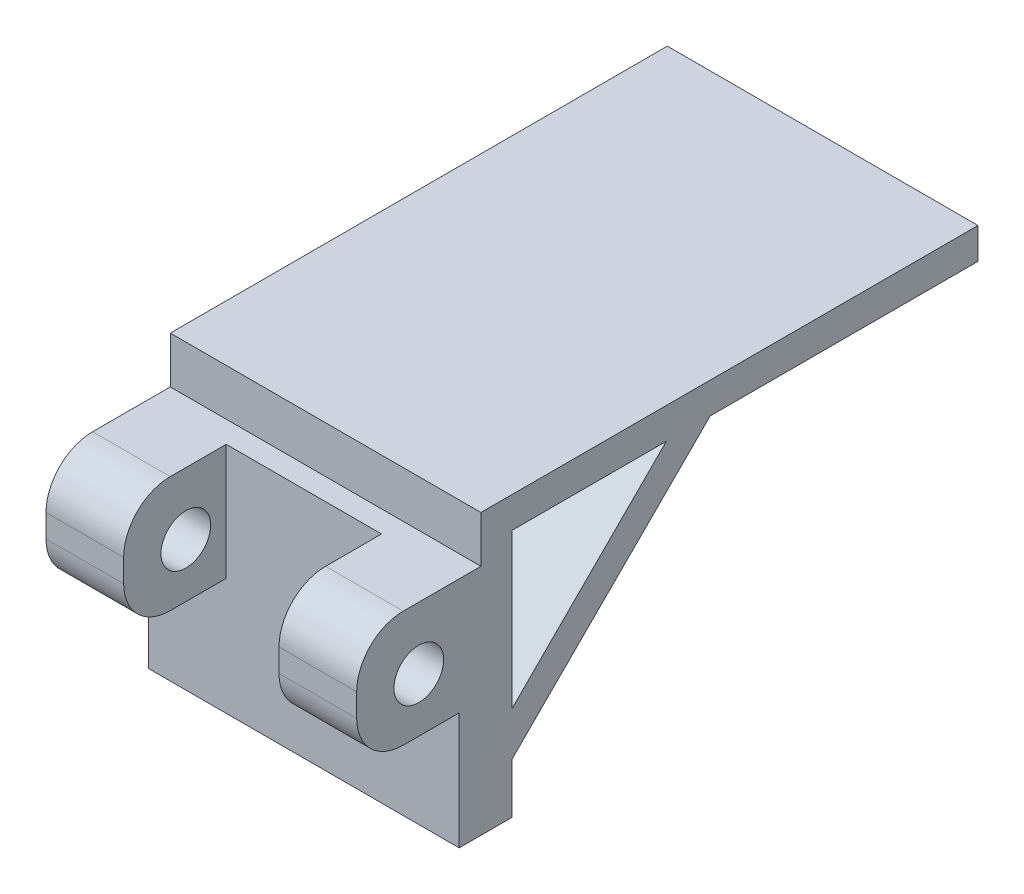
ISO-10303-21;
HEADER;
FILE_DESCRIPTION(('STEP AP214'),'2;1');
FILE_NAME('part.step','',(''),(''),'','','');
FILE_SCHEMA(('AUTOMOTIVE_DESIGN { 1 0 10303 214 1 1 1 1 }'));
ENDSEC;
DATA;
#1=APPLICATION_CONTEXT('core data for automotive mechanical design processes');
#2=APPLICATION_PROTOCOL_DEFINITION('international standard','automotive_design',2000,#1);
#3=PRODUCT_CONTEXT('',#1,'mechanical');
#4=PRODUCT('Part','Part','',(#3));
#5=PRODUCT_RELATED_PRODUCT_CATEGORY('part','',(#4));
#6=PRODUCT_DEFINITION_FORMATION('','',#4);
#7=PRODUCT_DEFINITION_CONTEXT('part definition',#1,'design');
#8=PRODUCT_DEFINITION('design','',#6,#7);
#9=PRODUCT_DEFINITION_SHAPE('','',#8);
#10=(LENGTH_UNIT() NAMED_UNIT(*) SI_UNIT(.MILLI.,.METRE.));
#11=(NAMED_UNIT(*) PLANE_ANGLE_UNIT() SI_UNIT($,.RADIAN.));
#12=(NAMED_UNIT(*) SI_UNIT($,.STERADIAN.) SOLID_ANGLE_UNIT());
#13=UNCERTAINTY_MEASURE_WITH_UNIT(LENGTH_MEASURE(1.E-05),#10,'distance_accuracy_value','');
#14=(GEOMETRIC_REPRESENTATION_CONTEXT(3) GLOBAL_UNCERTAINTY_ASSIGNED_CONTEXT((#13)) GLOBAL_UNIT_ASSIGNED_CONTEXT((#10,
#11,#12)) REPRESENTATION_CONTEXT('',''));
#15=CARTESIAN_POINT('',(0.,0.,0.));
#16=DIRECTION('',(0.,0.,1.));
#17=DIRECTION('',(1.,0.,0.));
#18=AXIS2_PLACEMENT_3D('',#15,#16,#17);
#19=CARTESIAN_POINT('',(5.,0.,8.));
#20=DIRECTION('',(1.,0.,0.));
#21=DIRECTION('',(0.,0.,-1.));
#22=AXIS2_PLACEMENT_3D('',#19,#20,#21);
#23=PLANE('',#22);
#24=CARTESIAN_POINT('',(5.,3.5,4.));
#25=DIRECTION('',(1.,0.,0.));
#26=DIRECTION('',(0.,0.,-1.));
#27=AXIS2_PLACEMENT_3D('',#24,#25,#26);
#28=CIRCLE('',#27,1.6);
#29=CARTESIAN_POINT('',(5.,3.5,2.4));
#30=VERTEX_POINT('',#29);
#31=EDGE_CURVE('E288',#30,#30,#28,.T.);
#32=ORIENTED_EDGE('',*,*,#31,.T.);
#33=EDGE_LOOP('',(#32));
#34=FACE_BOUND('',#33,.T.);
#35=DIRECTION('',(0.,1.,0.));
#36=VECTOR('',#35,1.);
#37=CARTESIAN_POINT('',(5.,0.0262521424332228,1.4));
#38=LINE('',#37,#36);
#39=CARTESIAN_POINT('',(5.,0.0262521424332228,1.4));
#40=VERTEX_POINT('',#39);
#41=CARTESIAN_POINT('',(5.,7.5,1.4));
#42=VERTEX_POINT('',#41);
#43=EDGE_CURVE('E195',#40,#42,#38,.T.);
#44=ORIENTED_EDGE('',*,*,#43,.F.);
#45=DIRECTION('',(0.,0.,1.));
#46=VECTOR('',#45,1.);
#47=CARTESIAN_POINT('',(5.,0.0262521424332228,-21.3692412432328));
#48=LINE('',#47,#46);
#49=CARTESIAN_POINT('',(5.,0.0262521424332228,4.99999999999999));
#50=VERTEX_POINT('',#49);
#51=EDGE_CURVE('E185',#40,#50,#48,.T.);
#52=ORIENTED_EDGE('',*,*,#51,.T.);
#53=CARTESIAN_POINT('',(5.,3.02625214243322,5.));
#54=DIRECTION('',(1.,0.,0.));
#55=DIRECTION('',(0.,0.,-1.));
#56=AXIS2_PLACEMENT_3D('',#53,#54,#55);
#57=CIRCLE('',#56,3.);
#58=CARTESIAN_POINT('',(5.,3.02625214243322,8.));
#59=VERTEX_POINT('',#58);
#60=EDGE_CURVE('E358',#50,#59,#57,.F.);
#61=ORIENTED_EDGE('',*,*,#60,.T.);
#62=DIRECTION('',(0.,-1.,0.));
#63=VECTOR('',#62,1.);
#64=CARTESIAN_POINT('',(5.,0.,8.));
#65=LINE('',#64,#63);
#66=CARTESIAN_POINT('',(5.,4.5,8.));
#67=VERTEX_POINT('',#66);
#68=EDGE_CURVE('E302',#67,#59,#65,.T.);
#69=ORIENTED_EDGE('',*,*,#68,.F.);
#70=CARTESIAN_POINT('',(5.,4.5,5.));
#71=DIRECTION('',(1.,0.,0.));
#72=DIRECTION('',(0.,0.,-1.));
#73=AXIS2_PLACEMENT_3D('',#70,#71,#72);
#74=CIRCLE('',#73,3.);
#75=CARTESIAN_POINT('',(5.,7.5,5.));
#76=VERTEX_POINT('',#75);
#77=EDGE_CURVE('E43',#67,#76,#74,.F.);
#78=ORIENTED_EDGE('',*,*,#77,.T.);
#79=DIRECTION('',(0.,0.,-1.));
#80=VECTOR('',#79,1.);
#81=CARTESIAN_POINT('',(5.,7.5,8.));
#82=LINE('',#81,#80);
#83=EDGE_CURVE('E50',#76,#42,#82,.T.);
#84=ORIENTED_EDGE('',*,*,#83,.T.);
#85=EDGE_LOOP('',(#44,#52,#61,#69,#78,#84));
#86=FACE_BOUND('',#85,.T.);
#87=ADVANCED_FACE('F35',(#34,#86),#23,.F.);
#88=CARTESIAN_POINT('',(-5.,0.,8.));
#89=DIRECTION('',(1.,0.,0.));
#90=DIRECTION('',(0.,0.,-1.));
#91=AXIS2_PLACEMENT_3D('',#88,#89,#90);
#92=PLANE('',#91);
#93=CARTESIAN_POINT('',(-5.,3.5,4.));
#94=DIRECTION('',(1.,0.,0.));
#95=DIRECTION('',(0.,0.,-1.));
#96=AXIS2_PLACEMENT_3D('',#93,#94,#95);
#97=CIRCLE('',#96,1.6);
#98=CARTESIAN_POINT('',(-5.,3.5,2.4));
#99=VERTEX_POINT('',#98);
#100=EDGE_CURVE('E283',#99,#99,#97,.T.);
#101=ORIENTED_EDGE('',*,*,#100,.F.);
#102=EDGE_LOOP('',(#101));
#103=FACE_BOUND('',#102,.T.);
#104=DIRECTION('',(0.,0.,1.));
#105=VECTOR('',#104,1.);
#106=CARTESIAN_POINT('',(-5.,0.0262521424332228,-21.3692412432328));
#107=LINE('',#106,#105);
#108=CARTESIAN_POINT('',(-5.,0.0262521424332228,1.39999999999999));
#109=VERTEX_POINT('',#108);
#110=CARTESIAN_POINT('',(-5.,0.0262521424332228,4.99999999999999));
#111=VERTEX_POINT('',#110);
#112=EDGE_CURVE('E192',#109,#111,#107,.T.);
#113=ORIENTED_EDGE('',*,*,#112,.F.);
#114=DIRECTION('',(0.,-1.,0.));
#115=VECTOR('',#114,1.);
#116=CARTESIAN_POINT('',(-5.,7.5,1.4));
#117=LINE('',#116,#115);
#118=CARTESIAN_POINT('',(-5.,7.5,1.4));
#119=VERTEX_POINT('',#118);
#120=EDGE_CURVE('E58',#119,#109,#117,.T.);
#121=ORIENTED_EDGE('',*,*,#120,.F.);
#122=DIRECTION('',(0.,0.,-1.));
#123=VECTOR('',#122,1.);
#124=CARTESIAN_POINT('',(-5.,7.5,8.));
#125=LINE('',#124,#123);
#126=CARTESIAN_POINT('',(-5.,7.5,5.));
#127=VERTEX_POINT('',#126);
#128=EDGE_CURVE('E324',#127,#119,#125,.T.);
#129=ORIENTED_EDGE('',*,*,#128,.F.);
#130=CARTESIAN_POINT('',(-5.,4.5,5.));
#131=DIRECTION('',(1.,0.,0.));
#132=DIRECTION('',(0.,0.,-1.));
#133=AXIS2_PLACEMENT_3D('',#130,#131,#132);
#134=CIRCLE('',#133,3.);
#135=CARTESIAN_POINT('',(-5.,4.5,8.));
#136=VERTEX_POINT('',#135);
#137=EDGE_CURVE('E338',#127,#136,#134,.T.);
#138=ORIENTED_EDGE('',*,*,#137,.T.);
#139=DIRECTION('',(0.,-1.,0.));
#140=VECTOR('',#139,1.);
#141=CARTESIAN_POINT('',(-5.,0.,8.));
#142=LINE('',#141,#140);
#143=CARTESIAN_POINT('',(-5.,3.02625214243322,8.));
#144=VERTEX_POINT('',#143);
#145=EDGE_CURVE('E305',#136,#144,#142,.T.);
#146=ORIENTED_EDGE('',*,*,#145,.T.);
#147=CARTESIAN_POINT('',(-5.,3.02625214243322,5.));
#148=DIRECTION('',(1.,0.,0.));
#149=DIRECTION('',(0.,0.,-1.));
#150=AXIS2_PLACEMENT_3D('',#147,#148,#149);
#151=CIRCLE('',#150,3.);
#152=EDGE_CURVE('E340',#144,#111,#151,.T.);
#153=ORIENTED_EDGE('',*,*,#152,.T.);
#154=EDGE_LOOP('',(#113,#121,#129,#138,#146,#153));
#155=FACE_BOUND('',#154,.T.);
#156=ADVANCED_FACE('F416',(#103,#155),#92,.T.);
#157=CARTESIAN_POINT('',(0.,0.,0.));
#158=DIRECTION('',(0.,0.,1.));
#159=DIRECTION('',(1.,0.,0.));
#160=AXIS2_PLACEMENT_3D('',#157,#158,#159);
#161=PLANE('',#160);
#162=DIRECTION('',(1.,0.,0.));
#163=VECTOR('',#162,1.);
#164=CARTESIAN_POINT('',(5.,7.5,0.));
#165=LINE('',#164,#163);
#166=CARTESIAN_POINT('',(-10.,7.5,0.));
#167=VERTEX_POINT('',#166);
#168=CARTESIAN_POINT('',(10.,7.5,0.));
#169=VERTEX_POINT('',#168);
#170=EDGE_CURVE('E261',#167,#169,#165,.T.);
#171=ORIENTED_EDGE('',*,*,#170,.T.);
#172=DIRECTION('',(0.,-1.,0.));
#173=VECTOR('',#172,1.);
#174=CARTESIAN_POINT('',(10.,10.5,0.));
#175=LINE('',#174,#173);
#176=CARTESIAN_POINT('',(10.,10.5,0.));
#177=VERTEX_POINT('',#176);
#178=EDGE_CURVE('E272',#177,#169,#175,.T.);
#179=ORIENTED_EDGE('',*,*,#178,.F.);
#180=DIRECTION('',(1.,0.,0.));
#181=VECTOR('',#180,1.);
#182=CARTESIAN_POINT('',(-5.,10.5,0.));
#183=LINE('',#182,#181);
#184=CARTESIAN_POINT('',(-10.,10.5,0.));
#185=VERTEX_POINT('',#184);
#186=EDGE_CURVE('E262',#185,#177,#183,.T.);
#187=ORIENTED_EDGE('',*,*,#186,.F.);
#188=DIRECTION('',(0.,-1.,0.));
#189=VECTOR('',#188,1.);
#190=CARTESIAN_POINT('',(-10.,10.5,0.));
#191=LINE('',#190,#189);
#192=EDGE_CURVE('E268',#185,#167,#191,.T.);
#193=ORIENTED_EDGE('',*,*,#192,.T.);
#194=EDGE_LOOP('',(#171,#179,#187,#193));
#195=FACE_BOUND('',#194,.T.);
#196=ADVANCED_FACE('F405',(#195),#161,.T.);
#197=CARTESIAN_POINT('',(0.,0.0262521424332228,-21.3692412432328));
#198=DIRECTION('',(0.,1.,0.));
#199=DIRECTION('',(-1.,0.,0.));
#200=AXIS2_PLACEMENT_3D('',#197,#198,#199);
#201=PLANE('',#200);
#202=DIRECTION('',(-1.,0.,0.));
#203=VECTOR('',#202,1.);
#204=CARTESIAN_POINT('',(-5.,0.0262521424332228,1.4));
#205=LINE('',#204,#203);
#206=CARTESIAN_POINT('',(-10.,0.0262521424332228,1.39999999999999));
#207=VERTEX_POINT('',#206);
#208=EDGE_CURVE('E210',#109,#207,#205,.T.);
#209=ORIENTED_EDGE('',*,*,#208,.F.);
#210=ORIENTED_EDGE('',*,*,#112,.T.);
#211=DIRECTION('',(-1.,0.,0.));
#212=VECTOR('',#211,1.);
#213=CARTESIAN_POINT('',(-10.,0.0262521424332224,5.));
#214=LINE('',#213,#212);
#215=CARTESIAN_POINT('',(-10.,0.0262521424332228,4.99999999999999));
#216=VERTEX_POINT('',#215);
#217=EDGE_CURVE('E327',#111,#216,#214,.T.);
#218=ORIENTED_EDGE('',*,*,#217,.T.);
#219=DIRECTION('',(0.,0.,1.));
#220=VECTOR('',#219,1.);
#221=CARTESIAN_POINT('',(-10.,0.0262521424332228,-21.3692412432328));
#222=LINE('',#221,#220);
#223=EDGE_CURVE('E275',#207,#216,#222,.T.);
#224=ORIENTED_EDGE('',*,*,#223,.F.);
#225=EDGE_LOOP('',(#209,#210,#218,#224));
#226=FACE_BOUND('',#225,.T.);
#227=ADVANCED_FACE('F428',(#226),#201,.F.);
#228=DIRECTION('',(-1.,0.,0.));
#229=VECTOR('',#228,1.);
#230=CARTESIAN_POINT('',(10.,0.0262521424332241,1.4));
#231=LINE('',#230,#229);
#232=CARTESIAN_POINT('',(10.,0.0262521424332228,1.39999999999999));
#233=VERTEX_POINT('',#232);
#234=EDGE_CURVE('E188',#233,#40,#231,.T.);
#235=ORIENTED_EDGE('',*,*,#234,.F.);
#236=DIRECTION('',(0.,0.,1.));
#237=VECTOR('',#236,1.);
#238=CARTESIAN_POINT('',(10.,0.0262521424332228,-21.3692412432328));
#239=LINE('',#238,#237);
#240=CARTESIAN_POINT('',(10.,0.0262521424332228,4.99999999999999));
#241=VERTEX_POINT('',#240);
#242=EDGE_CURVE('E193',#233,#241,#239,.T.);
#243=ORIENTED_EDGE('',*,*,#242,.T.);
#244=DIRECTION('',(-1.,0.,0.));
#245=VECTOR('',#244,1.);
#246=CARTESIAN_POINT('',(5.,0.0262521424332241,5.));
#247=LINE('',#246,#245);
#248=EDGE_CURVE('E11',#241,#50,#247,.T.);
#249=ORIENTED_EDGE('',*,*,#248,.T.);
#250=ORIENTED_EDGE('',*,*,#51,.F.);
#251=EDGE_LOOP('',(#235,#243,#249,#250));
#252=FACE_BOUND('',#251,.T.);
#253=ADVANCED_FACE('F186',(#252),#201,.F.);
#254=CARTESIAN_POINT('',(0.,0.,-2.));
#255=DIRECTION('',(0.,0.,1.));
#256=DIRECTION('',(1.,0.,0.));
#257=AXIS2_PLACEMENT_3D('',#254,#255,#256);
#258=PLANE('',#257);
#259=DIRECTION('',(0.,1.,0.));
#260=VECTOR('',#259,1.);
#261=CARTESIAN_POINT('',(10.,0.,-2.));
#262=LINE('',#261,#260);
#263=CARTESIAN_POINT('',(10.,-1.43463609528174,-2.));
#264=VERTEX_POINT('',#263);
#265=CARTESIAN_POINT('',(10.,8.5,-2.));
#266=VERTEX_POINT('',#265);
#267=EDGE_CURVE('E298',#264,#266,#262,.T.);
#268=ORIENTED_EDGE('',*,*,#267,.F.);
#269=DIRECTION('',(1.,0.,0.));
#270=VECTOR('',#269,1.);
#271=CARTESIAN_POINT('',(-28.0413136161507,-1.43463609528174,-2.));
#272=LINE('',#271,#270);
#273=CARTESIAN_POINT('',(-10.,-1.43463609528174,-2.));
#274=VERTEX_POINT('',#273);
#275=EDGE_CURVE('E231',#274,#264,#272,.T.);
#276=ORIENTED_EDGE('',*,*,#275,.F.);
#277=DIRECTION('',(0.,1.,0.));
#278=VECTOR('',#277,1.);
#279=CARTESIAN_POINT('',(-10.,0.,-2.));
#280=LINE('',#279,#278);
#281=CARTESIAN_POINT('',(-10.,8.5,-2.));
#282=VERTEX_POINT('',#281);
#283=EDGE_CURVE('E291',#274,#282,#280,.T.);
#284=ORIENTED_EDGE('',*,*,#283,.T.);
#285=DIRECTION('',(-1.,0.,0.));
#286=VECTOR('',#285,1.);
#287=CARTESIAN_POINT('',(10.,8.5,-2.));
#288=LINE('',#287,#286);
#289=EDGE_CURVE('E239',#266,#282,#288,.T.);
#290=ORIENTED_EDGE('',*,*,#289,.F.);
#291=EDGE_LOOP('',(#268,#276,#284,#290));
#292=FACE_BOUND('',#291,.T.);
#293=ADVANCED_FACE('F435',(#292),#258,.F.);
#294=CARTESIAN_POINT('',(10.,8.5,-32.));
#295=DIRECTION('',(0.,1.,0.));
#296=DIRECTION('',(-1.,0.,0.));
#297=AXIS2_PLACEMENT_3D('',#294,#295,#296);
#298=PLANE('',#297);
#299=DIRECTION('',(0.,0.,1.));
#300=VECTOR('',#299,1.);
#301=CARTESIAN_POINT('',(-10.,8.5,-32.));
#302=LINE('',#301,#300);
#303=CARTESIAN_POINT('',(-10.,8.5,-11.9346360952817));
#304=VERTEX_POINT('',#303);
#305=EDGE_CURVE('E251',#304,#282,#302,.T.);
#306=ORIENTED_EDGE('',*,*,#305,.F.);
#307=DIRECTION('',(1.,0.,0.));
#308=VECTOR('',#307,1.);
#309=CARTESIAN_POINT('',(-28.0413136161507,8.5,-11.9346360952817));
#310=LINE('',#309,#308);
#311=CARTESIAN_POINT('',(10.,8.5,-11.9346360952817));
#312=VERTEX_POINT('',#311);
#313=EDGE_CURVE('E222',#304,#312,#310,.T.);
#314=ORIENTED_EDGE('',*,*,#313,.T.);
#315=DIRECTION('',(0.,0.,1.));
#316=VECTOR('',#315,1.);
#317=CARTESIAN_POINT('',(10.,8.5,-32.));
#318=LINE('',#317,#316);
#319=EDGE_CURVE('E257',#312,#266,#318,.T.);
#320=ORIENTED_EDGE('',*,*,#319,.T.);
#321=ORIENTED_EDGE('',*,*,#289,.T.);
#322=EDGE_LOOP('',(#306,#314,#320,#321));
#323=FACE_BOUND('',#322,.T.);
#324=ADVANCED_FACE('F465',(#323),#298,.F.);
#325=CARTESIAN_POINT('',(-10.,-7.5,-2.));
#326=VERTEX_POINT('',#325);
#327=CARTESIAN_POINT('',(-10.,-4.25713519949338,-2.));
#328=VERTEX_POINT('',#327);
#329=EDGE_CURVE('E292',#326,#328,#280,.T.);
#330=ORIENTED_EDGE('',*,*,#329,.T.);
#331=DIRECTION('',(1.,0.,0.));
#332=VECTOR('',#331,1.);
#333=CARTESIAN_POINT('',(-28.0413136161507,-4.25713519949339,-2.));
#334=LINE('',#333,#332);
#335=CARTESIAN_POINT('',(10.,-4.25713519949339,-2.));
#336=VERTEX_POINT('',#335);
#337=EDGE_CURVE('E228',#328,#336,#334,.T.);
#338=ORIENTED_EDGE('',*,*,#337,.T.);
#339=CARTESIAN_POINT('',(10.,-7.5,-2.));
#340=VERTEX_POINT('',#339);
#341=EDGE_CURVE('E299',#340,#336,#262,.T.);
#342=ORIENTED_EDGE('',*,*,#341,.F.);
#343=DIRECTION('',(1.,0.,0.));
#344=VECTOR('',#343,1.);
#345=CARTESIAN_POINT('',(0.,-7.5,-2.));
#346=LINE('',#345,#344);
#347=EDGE_CURVE('E295',#326,#340,#346,.T.);
#348=ORIENTED_EDGE('',*,*,#347,.F.);
#349=EDGE_LOOP('',(#330,#338,#342,#348));
#350=FACE_BOUND('',#349,.T.);
#351=ADVANCED_FACE('F384',(#350),#258,.F.);
#352=CARTESIAN_POINT('',(0.,7.5,8.));
#353=DIRECTION('',(0.,1.,0.));
#354=DIRECTION('',(0.,0.,1.));
#355=AXIS2_PLACEMENT_3D('',#352,#353,#354);
#356=PLANE('',#355);
#357=ORIENTED_EDGE('',*,*,#128,.T.);
#358=DIRECTION('',(-1.,0.,0.));
#359=VECTOR('',#358,1.);
#360=CARTESIAN_POINT('',(-5.,7.5,1.4));
#361=LINE('',#360,#359);
#362=EDGE_CURVE('E199',#42,#119,#361,.T.);
#363=ORIENTED_EDGE('',*,*,#362,.F.);
#364=ORIENTED_EDGE('',*,*,#83,.F.);
#365=DIRECTION('',(1.,0.,0.));
#366=VECTOR('',#365,1.);
#367=CARTESIAN_POINT('',(0.,7.5,5.));
#368=LINE('',#367,#366);
#369=CARTESIAN_POINT('',(10.,7.5,5.));
#370=VERTEX_POINT('',#369);
#371=EDGE_CURVE('E343',#76,#370,#368,.T.);
#372=ORIENTED_EDGE('',*,*,#371,.T.);
#373=DIRECTION('',(0.,0.,-1.));
#374=VECTOR('',#373,1.);
#375=CARTESIAN_POINT('',(10.,7.5,8.));
#376=LINE('',#375,#374);
#377=EDGE_CURVE('E314',#370,#169,#376,.T.);
#378=ORIENTED_EDGE('',*,*,#377,.T.);
#379=ORIENTED_EDGE('',*,*,#170,.F.);
#380=DIRECTION('',(0.,0.,-1.));
#381=VECTOR('',#380,1.);
#382=CARTESIAN_POINT('',(-10.,7.5,8.));
#383=LINE('',#382,#381);
#384=CARTESIAN_POINT('',(-10.,7.5,5.));
#385=VERTEX_POINT('',#384);
#386=EDGE_CURVE('E321',#385,#167,#383,.T.);
#387=ORIENTED_EDGE('',*,*,#386,.F.);
#388=DIRECTION('',(1.,0.,0.));
#389=VECTOR('',#388,1.);
#390=CARTESIAN_POINT('',(0.,7.5,5.));
#391=LINE('',#390,#389);
#392=EDGE_CURVE('E346',#385,#127,#391,.T.);
#393=ORIENTED_EDGE('',*,*,#392,.T.);
#394=EDGE_LOOP('',(#357,#363,#364,#372,#378,#379,#387,#393));
#395=FACE_BOUND('',#394,.T.);
#396=ADVANCED_FACE('F365',(#395),#356,.T.);
#397=CARTESIAN_POINT('',(0.,-7.5,8.));
#398=DIRECTION('',(0.,1.,0.));
#399=DIRECTION('',(0.,0.,1.));
#400=AXIS2_PLACEMENT_3D('',#397,#398,#399);
#401=PLANE('',#400);
#402=DIRECTION('',(0.,0.,-1.));
#403=VECTOR('',#402,1.);
#404=CARTESIAN_POINT('',(10.,-7.5,8.));
#405=LINE('',#404,#403);
#406=CARTESIAN_POINT('',(10.,-7.5,1.4));
#407=VERTEX_POINT('',#406);
#408=EDGE_CURVE('E317',#407,#340,#405,.T.);
#409=ORIENTED_EDGE('',*,*,#408,.F.);
#410=DIRECTION('',(1.,0.,0.));
#411=VECTOR('',#410,1.);
#412=CARTESIAN_POINT('',(-10.,-7.5,1.4));
#413=LINE('',#412,#411);
#414=CARTESIAN_POINT('',(-10.,-7.5,1.4));
#415=VERTEX_POINT('',#414);
#416=EDGE_CURVE('E216',#415,#407,#413,.T.);
#417=ORIENTED_EDGE('',*,*,#416,.F.);
#418=DIRECTION('',(0.,0.,-1.));
#419=VECTOR('',#418,1.);
#420=CARTESIAN_POINT('',(-10.,-7.5,8.));
#421=LINE('',#420,#419);
#422=EDGE_CURVE('E319',#415,#326,#421,.T.);
#423=ORIENTED_EDGE('',*,*,#422,.T.);
#424=ORIENTED_EDGE('',*,*,#347,.T.);
#425=EDGE_LOOP('',(#409,#417,#423,#424));
#426=FACE_BOUND('',#425,.T.);
#427=ADVANCED_FACE('F381',(#426),#401,.F.);
#428=CARTESIAN_POINT('',(0.,0.,8.));
#429=DIRECTION('',(0.,0.,1.));
#430=DIRECTION('',(1.,0.,0.));
#431=AXIS2_PLACEMENT_3D('',#428,#429,#430);
#432=PLANE('',#431);
#433=DIRECTION('',(0.,1.,0.));
#434=VECTOR('',#433,1.);
#435=CARTESIAN_POINT('',(-10.,0.,8.));
#436=LINE('',#435,#434);
#437=CARTESIAN_POINT('',(-10.,3.02625214243322,8.));
#438=VERTEX_POINT('',#437);
#439=CARTESIAN_POINT('',(-10.,4.5,8.));
#440=VERTEX_POINT('',#439);
#441=EDGE_CURVE('E308',#438,#440,#436,.T.);
#442=ORIENTED_EDGE('',*,*,#441,.F.);
#443=DIRECTION('',(-1.,0.,0.));
#444=VECTOR('',#443,1.);
#445=CARTESIAN_POINT('',(-5.,3.02625214243322,8.));
#446=LINE('',#445,#444);
#447=EDGE_CURVE('E336',#438,#144,#446,.F.);
#448=ORIENTED_EDGE('',*,*,#447,.T.);
#449=ORIENTED_EDGE('',*,*,#145,.F.);
#450=DIRECTION('',(1.,0.,0.));
#451=VECTOR('',#450,1.);
#452=CARTESIAN_POINT('',(0.,4.5,8.));
#453=LINE('',#452,#451);
#454=EDGE_CURVE('E334',#136,#440,#453,.F.);
#455=ORIENTED_EDGE('',*,*,#454,.T.);
#456=EDGE_LOOP('',(#442,#448,#449,#455));
#457=FACE_BOUND('',#456,.T.);
#458=ADVANCED_FACE('F420',(#457),#432,.T.);
#459=CARTESIAN_POINT('',(-10.,0.,8.));
#460=DIRECTION('',(-1.,0.,0.));
#461=DIRECTION('',(0.,0.,1.));
#462=AXIS2_PLACEMENT_3D('',#459,#460,#461);
#463=PLANE('',#462);
#464=DIRECTION('',(0.,0.707106781186548,-0.707106781186547));
#465=VECTOR('',#464,1.);
#466=CARTESIAN_POINT('',(-10.,-4.25713519949339,-2.));
#467=LINE('',#466,#465);
#468=CARTESIAN_POINT('',(-10.,8.5,-14.7571351994934));
#469=VERTEX_POINT('',#468);
#470=EDGE_CURVE('E225',#328,#469,#467,.T.);
#471=ORIENTED_EDGE('',*,*,#470,.F.);
#472=ORIENTED_EDGE('',*,*,#329,.F.);
#473=ORIENTED_EDGE('',*,*,#422,.F.);
#474=DIRECTION('',(0.,-1.,0.));
#475=VECTOR('',#474,1.);
#476=CARTESIAN_POINT('',(-10.,0.0262521424332215,1.4));
#477=LINE('',#476,#475);
#478=EDGE_CURVE('E213',#207,#415,#477,.T.);
#479=ORIENTED_EDGE('',*,*,#478,.F.);
#480=ORIENTED_EDGE('',*,*,#223,.T.);
#481=CARTESIAN_POINT('',(-10.,3.02625214243322,5.));
#482=DIRECTION('',(-1.,0.,0.));
#483=DIRECTION('',(0.,0.,1.));
#484=AXIS2_PLACEMENT_3D('',#481,#482,#483);
#485=CIRCLE('',#484,3.);
#486=EDGE_CURVE('E332',#216,#438,#485,.T.);
#487=ORIENTED_EDGE('',*,*,#486,.T.);
#488=ORIENTED_EDGE('',*,*,#441,.T.);
#489=CARTESIAN_POINT('',(-10.,4.5,5.));
#490=DIRECTION('',(-1.,0.,0.));
#491=DIRECTION('',(0.,0.,1.));
#492=AXIS2_PLACEMENT_3D('',#489,#490,#491);
#493=CIRCLE('',#492,3.);
#494=EDGE_CURVE('E330',#440,#385,#493,.T.);
#495=ORIENTED_EDGE('',*,*,#494,.T.);
#496=ORIENTED_EDGE('',*,*,#386,.T.);
#497=ORIENTED_EDGE('',*,*,#192,.F.);
#498=DIRECTION('',(0.,0.,1.));
#499=VECTOR('',#498,1.);
#500=CARTESIAN_POINT('',(-10.,10.5,0.));
#501=LINE('',#500,#499);
#502=CARTESIAN_POINT('',(-10.,10.5,-32.));
#503=VERTEX_POINT('',#502);
#504=EDGE_CURVE('E266',#503,#185,#501,.T.);
#505=ORIENTED_EDGE('',*,*,#504,.F.);
#506=DIRECTION('',(0.,1.,0.));
#507=VECTOR('',#506,1.);
#508=CARTESIAN_POINT('',(-10.,8.5,-32.));
#509=LINE('',#508,#507);
#510=CARTESIAN_POINT('',(-10.,8.5,-32.));
#511=VERTEX_POINT('',#510);
#512=EDGE_CURVE('E245',#511,#503,#509,.T.);
#513=ORIENTED_EDGE('',*,*,#512,.F.);
#514=EDGE_CURVE('E254',#511,#469,#302,.T.);
#515=ORIENTED_EDGE('',*,*,#514,.T.);
#516=EDGE_LOOP('',(#471,#472,#473,#479,#480,#487,#488,#495,#496,#497,#505,#513,#515));
#517=FACE_BOUND('',#516,.T.);
#518=ORIENTED_EDGE('',*,*,#283,.F.);
#519=DIRECTION('',(0.,-0.707106781186548,0.707106781186547));
#520=VECTOR('',#519,1.);
#521=CARTESIAN_POINT('',(-10.,8.5,-11.9346360952817));
#522=LINE('',#521,#520);
#523=EDGE_CURVE('E229',#304,#274,#522,.T.);
#524=ORIENTED_EDGE('',*,*,#523,.F.);
#525=ORIENTED_EDGE('',*,*,#305,.T.);
#526=EDGE_LOOP('',(#518,#524,#525));
#527=FACE_BOUND('',#526,.T.);
#528=CARTESIAN_POINT('',(-10.,3.5,4.));
#529=DIRECTION('',(1.,0.,0.));
#530=DIRECTION('',(0.,1.,0.));
#531=AXIS2_PLACEMENT_3D('',#528,#529,#530);
#532=CIRCLE('',#531,1.6);
#533=CARTESIAN_POINT('',(-10.,5.1,4.));
#534=VERTEX_POINT('',#533);
#535=EDGE_CURVE('E280',#534,#534,#532,.T.);
#536=ORIENTED_EDGE('',*,*,#535,.T.);
#537=EDGE_LOOP('',(#536));
#538=FACE_BOUND('',#537,.T.);
#539=ADVANCED_FACE('F409',(#517,#527,#538),#463,.T.);
#540=CARTESIAN_POINT('',(10.,0.,8.));
#541=DIRECTION('',(-1.,0.,0.));
#542=DIRECTION('',(0.,0.,1.));
#543=AXIS2_PLACEMENT_3D('',#540,#541,#542);
#544=PLANE('',#543);
#545=DIRECTION('',(0.,1.,0.));
#546=VECTOR('',#545,1.);
#547=CARTESIAN_POINT('',(10.,-7.5,1.4));
#548=LINE('',#547,#546);
#549=EDGE_CURVE('E205',#407,#233,#548,.T.);
#550=ORIENTED_EDGE('',*,*,#549,.F.);
#551=ORIENTED_EDGE('',*,*,#408,.T.);
#552=ORIENTED_EDGE('',*,*,#341,.T.);
#553=DIRECTION('',(0.,0.707106781186548,-0.707106781186547));
#554=VECTOR('',#553,1.);
#555=CARTESIAN_POINT('',(10.,-4.25713519949339,-2.));
#556=LINE('',#555,#554);
#557=CARTESIAN_POINT('',(10.,8.5,-14.7571351994934));
#558=VERTEX_POINT('',#557);
#559=EDGE_CURVE('E219',#336,#558,#556,.T.);
#560=ORIENTED_EDGE('',*,*,#559,.T.);
#561=CARTESIAN_POINT('',(10.,8.5,-32.));
#562=VERTEX_POINT('',#561);
#563=EDGE_CURVE('E258',#562,#558,#318,.T.);
#564=ORIENTED_EDGE('',*,*,#563,.F.);
#565=DIRECTION('',(0.,-1.,0.));
#566=VECTOR('',#565,1.);
#567=CARTESIAN_POINT('',(10.,10.5,-32.));
#568=LINE('',#567,#566);
#569=CARTESIAN_POINT('',(10.,10.5,-32.));
#570=VERTEX_POINT('',#569);
#571=EDGE_CURVE('E240',#570,#562,#568,.T.);
#572=ORIENTED_EDGE('',*,*,#571,.F.);
#573=DIRECTION('',(0.,0.,-1.));
#574=VECTOR('',#573,1.);
#575=CARTESIAN_POINT('',(10.,10.5,0.));
#576=LINE('',#575,#574);
#577=EDGE_CURVE('E264',#177,#570,#576,.T.);
#578=ORIENTED_EDGE('',*,*,#577,.F.);
#579=ORIENTED_EDGE('',*,*,#178,.T.);
#580=ORIENTED_EDGE('',*,*,#377,.F.);
#581=CARTESIAN_POINT('',(10.,4.5,5.));
#582=DIRECTION('',(-1.,0.,0.));
#583=DIRECTION('',(0.,0.,1.));
#584=AXIS2_PLACEMENT_3D('',#581,#582,#583);
#585=CIRCLE('',#584,3.);
#586=CARTESIAN_POINT('',(10.,4.5,8.));
#587=VERTEX_POINT('',#586);
#588=EDGE_CURVE('E352',#370,#587,#585,.F.);
#589=ORIENTED_EDGE('',*,*,#588,.T.);
#590=DIRECTION('',(0.,1.,0.));
#591=VECTOR('',#590,1.);
#592=CARTESIAN_POINT('',(10.,0.,8.));
#593=LINE('',#592,#591);
#594=CARTESIAN_POINT('',(10.,3.02625214243322,8.));
#595=VERTEX_POINT('',#594);
#596=EDGE_CURVE('E311',#595,#587,#593,.T.);
#597=ORIENTED_EDGE('',*,*,#596,.F.);
#598=CARTESIAN_POINT('',(10.,3.02625214243322,5.));
#599=DIRECTION('',(-1.,0.,0.));
#600=DIRECTION('',(0.,0.,1.));
#601=AXIS2_PLACEMENT_3D('',#598,#599,#600);
#602=CIRCLE('',#601,3.);
#603=EDGE_CURVE('E349',#595,#241,#602,.F.);
#604=ORIENTED_EDGE('',*,*,#603,.T.);
#605=ORIENTED_EDGE('',*,*,#242,.F.);
#606=EDGE_LOOP('',(#550,#551,#552,#560,#564,#572,#578,#579,#580,#589,#597,#604,#605));
#607=FACE_BOUND('',#606,.T.);
#608=CARTESIAN_POINT('',(10.,3.5,4.));
#609=DIRECTION('',(1.,0.,0.));
#610=DIRECTION('',(0.,1.,0.));
#611=AXIS2_PLACEMENT_3D('',#608,#609,#610);
#612=CIRCLE('',#611,1.6);
#613=CARTESIAN_POINT('',(10.,5.1,4.));
#614=VERTEX_POINT('',#613);
#615=EDGE_CURVE('E277',#614,#614,#612,.T.);
#616=ORIENTED_EDGE('',*,*,#615,.F.);
#617=EDGE_LOOP('',(#616));
#618=FACE_BOUND('',#617,.T.);
#619=DIRECTION('',(0.,-0.707106781186548,0.707106781186547));
#620=VECTOR('',#619,1.);
#621=CARTESIAN_POINT('',(10.,8.5,-11.9346360952817));
#622=LINE('',#621,#620);
#623=EDGE_CURVE('E220',#312,#264,#622,.T.);
#624=ORIENTED_EDGE('',*,*,#623,.T.);
#625=ORIENTED_EDGE('',*,*,#267,.T.);
#626=ORIENTED_EDGE('',*,*,#319,.F.);
#627=EDGE_LOOP('',(#624,#625,#626));
#628=FACE_BOUND('',#627,.T.);
#629=ADVANCED_FACE('F370',(#607,#618,#628),#544,.F.);
#630=ORIENTED_EDGE('',*,*,#596,.T.);
#631=DIRECTION('',(1.,0.,0.));
#632=VECTOR('',#631,1.);
#633=CARTESIAN_POINT('',(0.,4.5,8.));
#634=LINE('',#633,#632);
#635=EDGE_CURVE('E356',#587,#67,#634,.F.);
#636=ORIENTED_EDGE('',*,*,#635,.T.);
#637=ORIENTED_EDGE('',*,*,#68,.T.);
#638=DIRECTION('',(-1.,0.,0.));
#639=VECTOR('',#638,1.);
#640=CARTESIAN_POINT('',(10.,3.02625214243322,8.));
#641=LINE('',#640,#639);
#642=EDGE_CURVE('E354',#59,#595,#641,.F.);
#643=ORIENTED_EDGE('',*,*,#642,.T.);
#644=EDGE_LOOP('',(#630,#636,#637,#643));
#645=FACE_BOUND('',#644,.T.);
#646=ADVANCED_FACE('F374',(#645),#432,.T.);
#647=CARTESIAN_POINT('',(-10.,3.5,4.));
#648=DIRECTION('',(1.,0.,0.));
#649=DIRECTION('',(0.,1.,0.));
#650=AXIS2_PLACEMENT_3D('',#647,#648,#649);
#651=CYLINDRICAL_SURFACE('',#650,1.6);
#652=ORIENTED_EDGE('',*,*,#615,.T.);
#653=EDGE_LOOP('',(#652));
#654=FACE_BOUND('',#653,.T.);
#655=ORIENTED_EDGE('',*,*,#31,.F.);
#656=EDGE_LOOP('',(#655));
#657=FACE_BOUND('',#656,.T.);
#658=ADVANCED_FACE('F638',(#654,#657),#651,.F.);
#659=ORIENTED_EDGE('',*,*,#100,.T.);
#660=EDGE_LOOP('',(#659));
#661=FACE_BOUND('',#660,.T.);
#662=ORIENTED_EDGE('',*,*,#535,.F.);
#663=EDGE_LOOP('',(#662));
#664=FACE_BOUND('',#663,.T.);
#665=ADVANCED_FACE('F452',(#661,#664),#651,.F.);
#666=CARTESIAN_POINT('',(0.,3.02625214243322,5.));
#667=DIRECTION('',(1.,0.,0.));
#668=DIRECTION('',(0.,1.,0.));
#669=AXIS2_PLACEMENT_3D('',#666,#667,#668);
#670=CYLINDRICAL_SURFACE('',#669,3.);
#671=ORIENTED_EDGE('',*,*,#152,.F.);
#672=ORIENTED_EDGE('',*,*,#447,.F.);
#673=ORIENTED_EDGE('',*,*,#486,.F.);
#674=ORIENTED_EDGE('',*,*,#217,.F.);
#675=EDGE_LOOP('',(#671,#672,#673,#674));
#676=FACE_BOUND('',#675,.T.);
#677=ADVANCED_FACE('F424',(#676),#670,.T.);
#678=CARTESIAN_POINT('',(0.,4.5,5.));
#679=DIRECTION('',(1.,0.,0.));
#680=DIRECTION('',(0.,0.,-1.));
#681=AXIS2_PLACEMENT_3D('',#678,#679,#680);
#682=CYLINDRICAL_SURFACE('',#681,3.);
#683=ORIENTED_EDGE('',*,*,#494,.F.);
#684=ORIENTED_EDGE('',*,*,#454,.F.);
#685=ORIENTED_EDGE('',*,*,#137,.F.);
#686=ORIENTED_EDGE('',*,*,#392,.F.);
#687=EDGE_LOOP('',(#683,#684,#685,#686));
#688=FACE_BOUND('',#687,.T.);
#689=ADVANCED_FACE('F415',(#688),#682,.T.);
#690=CARTESIAN_POINT('',(0.,4.5,5.));
#691=DIRECTION('',(1.,0.,0.));
#692=DIRECTION('',(0.,0.,-1.));
#693=AXIS2_PLACEMENT_3D('',#690,#691,#692);
#694=CYLINDRICAL_SURFACE('',#693,3.);
#695=ORIENTED_EDGE('',*,*,#77,.F.);
#696=ORIENTED_EDGE('',*,*,#635,.F.);
#697=ORIENTED_EDGE('',*,*,#588,.F.);
#698=ORIENTED_EDGE('',*,*,#371,.F.);
#699=EDGE_LOOP('',(#695,#696,#697,#698));
#700=FACE_BOUND('',#699,.T.);
#701=ADVANCED_FACE('F367',(#700),#694,.T.);
#702=CARTESIAN_POINT('',(0.,3.02625214243322,5.));
#703=DIRECTION('',(1.,0.,0.));
#704=DIRECTION('',(0.,1.,0.));
#705=AXIS2_PLACEMENT_3D('',#702,#703,#704);
#706=CYLINDRICAL_SURFACE('',#705,3.);
#707=ORIENTED_EDGE('',*,*,#603,.F.);
#708=ORIENTED_EDGE('',*,*,#642,.F.);
#709=ORIENTED_EDGE('',*,*,#60,.F.);
#710=ORIENTED_EDGE('',*,*,#248,.F.);
#711=EDGE_LOOP('',(#707,#708,#709,#710));
#712=FACE_BOUND('',#711,.T.);
#713=ADVANCED_FACE('F37',(#712),#706,.T.);
#714=CARTESIAN_POINT('',(0.,10.5,0.));
#715=DIRECTION('',(0.,-1.,0.));
#716=DIRECTION('',(0.,0.,-1.));
#717=AXIS2_PLACEMENT_3D('',#714,#715,#716);
#718=PLANE('',#717);
#719=ORIENTED_EDGE('',*,*,#186,.T.);
#720=ORIENTED_EDGE('',*,*,#577,.T.);
#721=DIRECTION('',(1.,0.,0.));
#722=VECTOR('',#721,1.);
#723=CARTESIAN_POINT('',(10.,10.5,-32.));
#724=LINE('',#723,#722);
#725=EDGE_CURVE('E248',#503,#570,#724,.T.);
#726=ORIENTED_EDGE('',*,*,#725,.F.);
#727=ORIENTED_EDGE('',*,*,#504,.T.);
#728=EDGE_LOOP('',(#719,#720,#726,#727));
#729=FACE_BOUND('',#728,.T.);
#730=ADVANCED_FACE('F401',(#729),#718,.F.);
#731=ORIENTED_EDGE('',*,*,#563,.T.);
#732=DIRECTION('',(1.,0.,0.));
#733=VECTOR('',#732,1.);
#734=CARTESIAN_POINT('',(-28.0413136161507,8.5,-14.7571351994934));
#735=LINE('',#734,#733);
#736=EDGE_CURVE('E227',#469,#558,#735,.T.);
#737=ORIENTED_EDGE('',*,*,#736,.F.);
#738=ORIENTED_EDGE('',*,*,#514,.F.);
#739=DIRECTION('',(-1.,0.,0.));
#740=VECTOR('',#739,1.);
#741=CARTESIAN_POINT('',(10.,8.5,-32.));
#742=LINE('',#741,#740);
#743=EDGE_CURVE('E243',#562,#511,#742,.T.);
#744=ORIENTED_EDGE('',*,*,#743,.F.);
#745=EDGE_LOOP('',(#731,#737,#738,#744));
#746=FACE_BOUND('',#745,.T.);
#747=ADVANCED_FACE('F392',(#746),#298,.F.);
#748=CARTESIAN_POINT('',(0.,0.,-32.));
#749=DIRECTION('',(0.,0.,-1.));
#750=DIRECTION('',(-1.,0.,0.));
#751=AXIS2_PLACEMENT_3D('',#748,#749,#750);
#752=PLANE('',#751);
#753=ORIENTED_EDGE('',*,*,#571,.T.);
#754=ORIENTED_EDGE('',*,*,#743,.T.);
#755=ORIENTED_EDGE('',*,*,#512,.T.);
#756=ORIENTED_EDGE('',*,*,#725,.T.);
#757=EDGE_LOOP('',(#753,#754,#755,#756));
#758=FACE_BOUND('',#757,.T.);
#759=ADVANCED_FACE('F396',(#758),#752,.T.);
#760=CARTESIAN_POINT('',(-28.0413136161507,8.5,-11.9346360952817));
#761=DIRECTION('',(0.,0.707106781186547,0.707106781186548));
#762=DIRECTION('',(0.,-0.707106781186548,0.707106781186547));
#763=AXIS2_PLACEMENT_3D('',#760,#761,#762);
#764=PLANE('',#763);
#765=ORIENTED_EDGE('',*,*,#313,.F.);
#766=ORIENTED_EDGE('',*,*,#523,.T.);
#767=ORIENTED_EDGE('',*,*,#275,.T.);
#768=ORIENTED_EDGE('',*,*,#623,.F.);
#769=EDGE_LOOP('',(#765,#766,#767,#768));
#770=FACE_BOUND('',#769,.T.);
#771=ADVANCED_FACE('F469',(#770),#764,.T.);
#772=CARTESIAN_POINT('',(-28.0413136161507,-4.25713519949339,-2.));
#773=DIRECTION('',(0.,-0.707106781186547,-0.707106781186548));
#774=DIRECTION('',(0.,0.707106781186548,-0.707106781186547));
#775=AXIS2_PLACEMENT_3D('',#772,#773,#774);
#776=PLANE('',#775);
#777=ORIENTED_EDGE('',*,*,#337,.F.);
#778=ORIENTED_EDGE('',*,*,#470,.T.);
#779=ORIENTED_EDGE('',*,*,#736,.T.);
#780=ORIENTED_EDGE('',*,*,#559,.F.);
#781=EDGE_LOOP('',(#777,#778,#779,#780));
#782=FACE_BOUND('',#781,.T.);
#783=ADVANCED_FACE('F387',(#782),#776,.T.);
#784=CARTESIAN_POINT('',(0.,0.,1.4));
#785=DIRECTION('',(0.,0.,-1.));
#786=DIRECTION('',(-1.,0.,0.));
#787=AXIS2_PLACEMENT_3D('',#784,#785,#786);
#788=PLANE('',#787);
#789=ORIENTED_EDGE('',*,*,#234,.T.);
#790=ORIENTED_EDGE('',*,*,#43,.T.);
#791=ORIENTED_EDGE('',*,*,#362,.T.);
#792=ORIENTED_EDGE('',*,*,#120,.T.);
#793=ORIENTED_EDGE('',*,*,#208,.T.);
#794=ORIENTED_EDGE('',*,*,#478,.T.);
#795=ORIENTED_EDGE('',*,*,#416,.T.);
#796=ORIENTED_EDGE('',*,*,#549,.T.);
#797=EDGE_LOOP('',(#789,#790,#791,#792,#793,#794,#795,#796));
#798=FACE_BOUND('',#797,.T.);
#799=ADVANCED_FACE('F202',(#798),#788,.F.);
#800=CLOSED_SHELL('',(#87,#156,#196,#227,#253,#293,#324,#351,#396,#427,#458,#539,#629,#646,#658,
#665,#677,#689,#701,#713,#730,#747,#759,#771,#783,#799));
#801=MANIFOLD_SOLID_BREP('B2',#800);
#802=ADVANCED_BREP_SHAPE_REPRESENTATION('',(#18,#801),#14);
#803=SHAPE_DEFINITION_REPRESENTATION(#9,#802);
ENDSEC;
END-ISO-10303-21;
